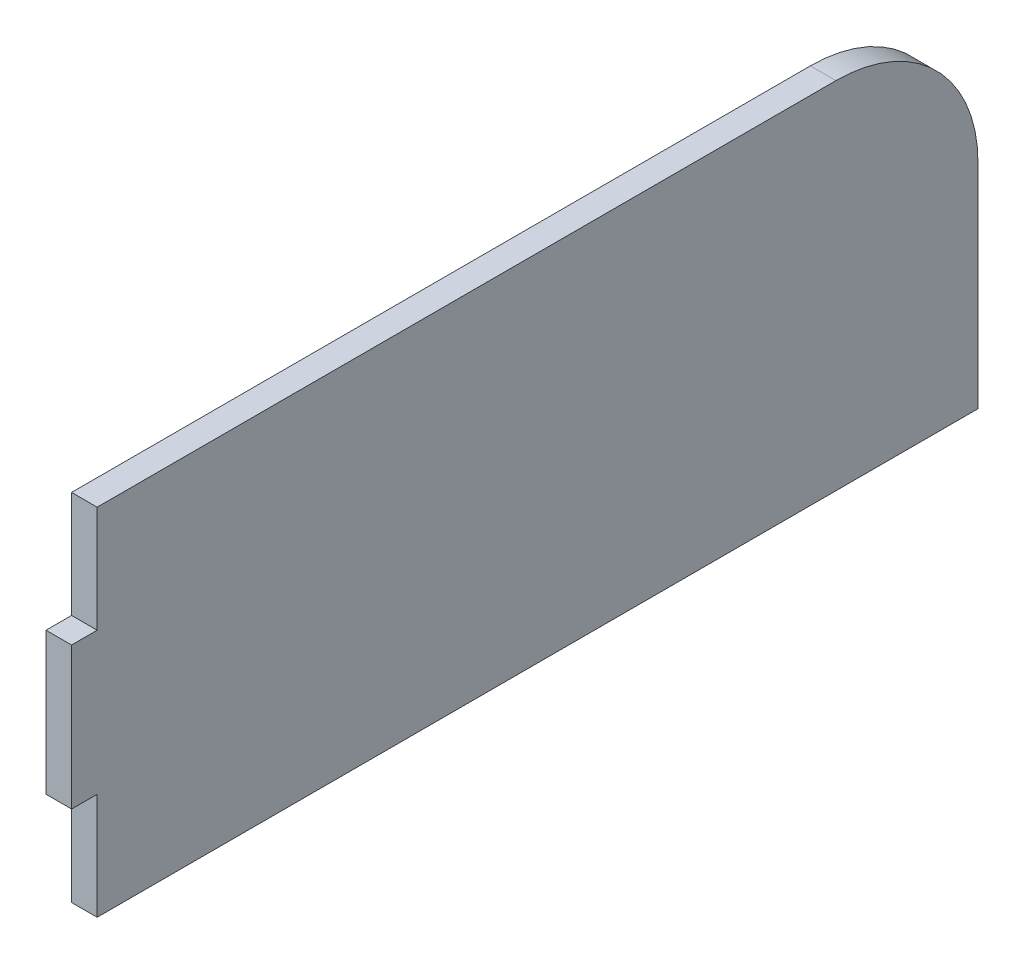
ISO-10303-21;
HEADER;
FILE_DESCRIPTION(('STEP AP214'),'2;1');
FILE_NAME('part.step','',(''),(''),'','','');
FILE_SCHEMA(('AUTOMOTIVE_DESIGN { 1 0 10303 214 1 1 1 1 }'));
ENDSEC;
DATA;
#1=APPLICATION_CONTEXT('core data for automotive mechanical design processes');
#2=APPLICATION_PROTOCOL_DEFINITION('international standard','automotive_design',2000,#1);
#3=PRODUCT_CONTEXT('',#1,'mechanical');
#4=PRODUCT('Part','Part','',(#3));
#5=PRODUCT_RELATED_PRODUCT_CATEGORY('part','',(#4));
#6=PRODUCT_DEFINITION_FORMATION('','',#4);
#7=PRODUCT_DEFINITION_CONTEXT('part definition',#1,'design');
#8=PRODUCT_DEFINITION('design','',#6,#7);
#9=PRODUCT_DEFINITION_SHAPE('','',#8);
#10=(LENGTH_UNIT() NAMED_UNIT(*) SI_UNIT(.MILLI.,.METRE.));
#11=(NAMED_UNIT(*) PLANE_ANGLE_UNIT() SI_UNIT($,.RADIAN.));
#12=(NAMED_UNIT(*) SI_UNIT($,.STERADIAN.) SOLID_ANGLE_UNIT());
#13=UNCERTAINTY_MEASURE_WITH_UNIT(LENGTH_MEASURE(1.E-05),#10,'distance_accuracy_value','');
#14=(GEOMETRIC_REPRESENTATION_CONTEXT(3) GLOBAL_UNCERTAINTY_ASSIGNED_CONTEXT((#13)) GLOBAL_UNIT_ASSIGNED_CONTEXT((#10,
#11,#12)) REPRESENTATION_CONTEXT('',''));
#15=CARTESIAN_POINT('',(0.,0.,0.));
#16=DIRECTION('',(0.,0.,1.));
#17=DIRECTION('',(1.,0.,0.));
#18=AXIS2_PLACEMENT_3D('',#15,#16,#17);
#19=CARTESIAN_POINT('',(18.,0.,0.));
#20=DIRECTION('',(0.,0.,-1.));
#21=DIRECTION('',(-1.,0.,0.));
#22=AXIS2_PLACEMENT_3D('',#19,#20,#21);
#23=PLANE('',#22);
#24=DIRECTION('',(0.,-1.,0.));
#25=VECTOR('',#24,1.);
#26=CARTESIAN_POINT('',(0.,0.,0.));
#27=LINE('',#26,#25);
#28=CARTESIAN_POINT('',(0.,0.,0.));
#29=VERTEX_POINT('',#28);
#30=CARTESIAN_POINT('',(0.,-75.0000000000002,0.));
#31=VERTEX_POINT('',#30);
#32=EDGE_CURVE('E135',#29,#31,#27,.T.);
#33=ORIENTED_EDGE('',*,*,#32,.T.);
#34=DIRECTION('',(-1.,0.,0.));
#35=VECTOR('',#34,1.);
#36=CARTESIAN_POINT('',(18.,-75.0000000000002,0.));
#37=LINE('',#36,#35);
#38=CARTESIAN_POINT('',(18.,-75.0000000000002,0.));
#39=VERTEX_POINT('',#38);
#40=EDGE_CURVE('E11',#39,#31,#37,.T.);
#41=ORIENTED_EDGE('',*,*,#40,.F.);
#42=DIRECTION('',(0.,-1.,0.));
#43=VECTOR('',#42,1.);
#44=CARTESIAN_POINT('',(18.,0.,0.));
#45=LINE('',#44,#43);
#46=CARTESIAN_POINT('',(18.,0.,0.));
#47=VERTEX_POINT('',#46);
#48=EDGE_CURVE('E151',#47,#39,#45,.T.);
#49=ORIENTED_EDGE('',*,*,#48,.F.);
#50=DIRECTION('',(-1.,0.,0.));
#51=VECTOR('',#50,1.);
#52=CARTESIAN_POINT('',(18.,0.,0.));
#53=LINE('',#52,#51);
#54=EDGE_CURVE('E131',#47,#29,#53,.T.);
#55=ORIENTED_EDGE('',*,*,#54,.T.);
#56=EDGE_LOOP('',(#33,#41,#49,#55));
#57=FACE_BOUND('',#56,.T.);
#58=ADVANCED_FACE('F33',(#57),#23,.F.);
#59=CARTESIAN_POINT('',(18.,-75.0000000000002,0.));
#60=DIRECTION('',(0.,-1.,0.));
#61=DIRECTION('',(0.,0.,-1.));
#62=AXIS2_PLACEMENT_3D('',#59,#60,#61);
#63=PLANE('',#62);
#64=DIRECTION('',(0.,0.,1.));
#65=VECTOR('',#64,1.);
#66=CARTESIAN_POINT('',(0.,-75.0000000000002,0.));
#67=LINE('',#66,#65);
#68=CARTESIAN_POINT('',(0.,-75.0000000000002,18.));
#69=VERTEX_POINT('',#68);
#70=EDGE_CURVE('E138',#31,#69,#67,.T.);
#71=ORIENTED_EDGE('',*,*,#70,.T.);
#72=DIRECTION('',(-1.,0.,0.));
#73=VECTOR('',#72,1.);
#74=CARTESIAN_POINT('',(18.,-75.0000000000002,18.));
#75=LINE('',#74,#73);
#76=CARTESIAN_POINT('',(18.,-75.0000000000002,18.));
#77=VERTEX_POINT('',#76);
#78=EDGE_CURVE('E41',#77,#69,#75,.T.);
#79=ORIENTED_EDGE('',*,*,#78,.F.);
#80=DIRECTION('',(0.,0.,1.));
#81=VECTOR('',#80,1.);
#82=CARTESIAN_POINT('',(18.,-75.0000000000002,0.));
#83=LINE('',#82,#81);
#84=EDGE_CURVE('E95',#39,#77,#83,.T.);
#85=ORIENTED_EDGE('',*,*,#84,.F.);
#86=ORIENTED_EDGE('',*,*,#40,.T.);
#87=EDGE_LOOP('',(#71,#79,#85,#86));
#88=FACE_BOUND('',#87,.T.);
#89=ADVANCED_FACE('F194',(#88),#63,.F.);
#90=CARTESIAN_POINT('',(18.,-75.0000000000002,18.));
#91=DIRECTION('',(0.,0.,-1.));
#92=DIRECTION('',(0.,1.,0.));
#93=AXIS2_PLACEMENT_3D('',#90,#91,#92);
#94=PLANE('',#93);
#95=DIRECTION('',(0.,-1.,0.));
#96=VECTOR('',#95,1.);
#97=CARTESIAN_POINT('',(0.,-75.0000000000002,18.));
#98=LINE('',#97,#96);
#99=CARTESIAN_POINT('',(0.,-175.,18.));
#100=VERTEX_POINT('',#99);
#101=EDGE_CURVE('E140',#69,#100,#98,.T.);
#102=ORIENTED_EDGE('',*,*,#101,.T.);
#103=DIRECTION('',(-1.,0.,0.));
#104=VECTOR('',#103,1.);
#105=CARTESIAN_POINT('',(18.,-175.,18.));
#106=LINE('',#105,#104);
#107=CARTESIAN_POINT('',(18.,-175.,18.));
#108=VERTEX_POINT('',#107);
#109=EDGE_CURVE('E161',#108,#100,#106,.T.);
#110=ORIENTED_EDGE('',*,*,#109,.F.);
#111=DIRECTION('',(0.,-1.,0.));
#112=VECTOR('',#111,1.);
#113=CARTESIAN_POINT('',(18.,-75.0000000000002,18.));
#114=LINE('',#113,#112);
#115=EDGE_CURVE('E169',#77,#108,#114,.T.);
#116=ORIENTED_EDGE('',*,*,#115,.F.);
#117=ORIENTED_EDGE('',*,*,#78,.T.);
#118=EDGE_LOOP('',(#102,#110,#116,#117));
#119=FACE_BOUND('',#118,.T.);
#120=ADVANCED_FACE('F167',(#119),#94,.F.);
#121=CARTESIAN_POINT('',(18.,-175.,0.));
#122=DIRECTION('',(0.,1.,0.));
#123=DIRECTION('',(0.,0.,1.));
#124=AXIS2_PLACEMENT_3D('',#121,#122,#123);
#125=PLANE('',#124);
#126=DIRECTION('',(0.,0.,-1.));
#127=VECTOR('',#126,1.);
#128=CARTESIAN_POINT('',(0.,-175.,0.));
#129=LINE('',#128,#127);
#130=CARTESIAN_POINT('',(0.,-175.,0.));
#131=VERTEX_POINT('',#130);
#132=EDGE_CURVE('E142',#100,#131,#129,.T.);
#133=ORIENTED_EDGE('',*,*,#132,.T.);
#134=DIRECTION('',(-1.,0.,0.));
#135=VECTOR('',#134,1.);
#136=CARTESIAN_POINT('',(18.,-175.,0.));
#137=LINE('',#136,#135);
#138=CARTESIAN_POINT('',(18.,-175.,0.));
#139=VERTEX_POINT('',#138);
#140=EDGE_CURVE('E158',#139,#131,#137,.T.);
#141=ORIENTED_EDGE('',*,*,#140,.F.);
#142=DIRECTION('',(0.,0.,-1.));
#143=VECTOR('',#142,1.);
#144=CARTESIAN_POINT('',(18.,-175.,0.));
#145=LINE('',#144,#143);
#146=EDGE_CURVE('E185',#108,#139,#145,.T.);
#147=ORIENTED_EDGE('',*,*,#146,.F.);
#148=ORIENTED_EDGE('',*,*,#109,.T.);
#149=EDGE_LOOP('',(#133,#141,#147,#148));
#150=FACE_BOUND('',#149,.T.);
#151=ADVANCED_FACE('F178',(#150),#125,.F.);
#152=CARTESIAN_POINT('',(18.,-175.,0.));
#153=DIRECTION('',(0.,0.,-1.));
#154=DIRECTION('',(-1.,0.,0.));
#155=AXIS2_PLACEMENT_3D('',#152,#153,#154);
#156=PLANE('',#155);
#157=DIRECTION('',(0.,-1.,0.));
#158=VECTOR('',#157,1.);
#159=CARTESIAN_POINT('',(0.,-175.,0.));
#160=LINE('',#159,#158);
#161=CARTESIAN_POINT('',(0.,-250.,0.));
#162=VERTEX_POINT('',#161);
#163=EDGE_CURVE('E144',#131,#162,#160,.T.);
#164=ORIENTED_EDGE('',*,*,#163,.T.);
#165=DIRECTION('',(-1.,0.,0.));
#166=VECTOR('',#165,1.);
#167=CARTESIAN_POINT('',(18.,-250.,0.));
#168=LINE('',#167,#166);
#169=CARTESIAN_POINT('',(18.,-250.,0.));
#170=VERTEX_POINT('',#169);
#171=EDGE_CURVE('E155',#170,#162,#168,.T.);
#172=ORIENTED_EDGE('',*,*,#171,.F.);
#173=DIRECTION('',(0.,-1.,0.));
#174=VECTOR('',#173,1.);
#175=CARTESIAN_POINT('',(18.,-175.,0.));
#176=LINE('',#175,#174);
#177=EDGE_CURVE('E184',#139,#170,#176,.T.);
#178=ORIENTED_EDGE('',*,*,#177,.F.);
#179=ORIENTED_EDGE('',*,*,#140,.T.);
#180=EDGE_LOOP('',(#164,#172,#178,#179));
#181=FACE_BOUND('',#180,.T.);
#182=ADVANCED_FACE('F182',(#181),#156,.F.);
#183=CARTESIAN_POINT('',(18.,-250.,0.));
#184=DIRECTION('',(0.,1.,0.));
#185=DIRECTION('',(0.,0.,1.));
#186=AXIS2_PLACEMENT_3D('',#183,#184,#185);
#187=PLANE('',#186);
#188=DIRECTION('',(0.,0.,-1.));
#189=VECTOR('',#188,1.);
#190=CARTESIAN_POINT('',(0.,-250.,0.));
#191=LINE('',#190,#189);
#192=CARTESIAN_POINT('',(0.,-250.,-620.));
#193=VERTEX_POINT('',#192);
#194=EDGE_CURVE('E146',#162,#193,#191,.T.);
#195=ORIENTED_EDGE('',*,*,#194,.T.);
#196=DIRECTION('',(-1.,0.,0.));
#197=VECTOR('',#196,1.);
#198=CARTESIAN_POINT('',(18.,-250.,-620.));
#199=LINE('',#198,#197);
#200=CARTESIAN_POINT('',(18.,-250.,-620.));
#201=VERTEX_POINT('',#200);
#202=EDGE_CURVE('E126',#201,#193,#199,.T.);
#203=ORIENTED_EDGE('',*,*,#202,.F.);
#204=DIRECTION('',(0.,0.,-1.));
#205=VECTOR('',#204,1.);
#206=CARTESIAN_POINT('',(18.,-250.,0.));
#207=LINE('',#206,#205);
#208=EDGE_CURVE('E117',#170,#201,#207,.T.);
#209=ORIENTED_EDGE('',*,*,#208,.F.);
#210=ORIENTED_EDGE('',*,*,#171,.T.);
#211=EDGE_LOOP('',(#195,#203,#209,#210));
#212=FACE_BOUND('',#211,.T.);
#213=ADVANCED_FACE('F206',(#212),#187,.F.);
#214=CARTESIAN_POINT('',(18.,-100.,-620.));
#215=DIRECTION('',(0.,0.,1.));
#216=DIRECTION('',(0.,-1.,0.));
#217=AXIS2_PLACEMENT_3D('',#214,#215,#216);
#218=PLANE('',#217);
#219=DIRECTION('',(0.,1.,0.));
#220=VECTOR('',#219,1.);
#221=CARTESIAN_POINT('',(0.,-100.,-620.));
#222=LINE('',#221,#220);
#223=CARTESIAN_POINT('',(0.,-100.,-620.));
#224=VERTEX_POINT('',#223);
#225=EDGE_CURVE('E125',#193,#224,#222,.T.);
#226=ORIENTED_EDGE('',*,*,#225,.T.);
#227=DIRECTION('',(-1.,0.,0.));
#228=VECTOR('',#227,1.);
#229=CARTESIAN_POINT('',(18.,-100.,-620.));
#230=LINE('',#229,#228);
#231=CARTESIAN_POINT('',(18.,-100.,-620.));
#232=VERTEX_POINT('',#231);
#233=EDGE_CURVE('E122',#232,#224,#230,.T.);
#234=ORIENTED_EDGE('',*,*,#233,.F.);
#235=DIRECTION('',(0.,1.,0.));
#236=VECTOR('',#235,1.);
#237=CARTESIAN_POINT('',(18.,-100.,-620.));
#238=LINE('',#237,#236);
#239=EDGE_CURVE('E111',#201,#232,#238,.T.);
#240=ORIENTED_EDGE('',*,*,#239,.F.);
#241=ORIENTED_EDGE('',*,*,#202,.T.);
#242=EDGE_LOOP('',(#226,#234,#240,#241));
#243=FACE_BOUND('',#242,.T.);
#244=ADVANCED_FACE('F123',(#243),#218,.F.);
#245=CARTESIAN_POINT('',(18.,-100.,-520.));
#246=DIRECTION('',(-1.,0.,0.));
#247=DIRECTION('',(0.,0.,1.));
#248=AXIS2_PLACEMENT_3D('',#245,#246,#247);
#249=CYLINDRICAL_SURFACE('',#248,99.9999999999999);
#250=CARTESIAN_POINT('',(0.,-100.,-520.));
#251=DIRECTION('',(1.,0.,0.));
#252=DIRECTION('',(0.,0.,-1.));
#253=AXIS2_PLACEMENT_3D('',#250,#251,#252);
#254=CIRCLE('',#253,99.9999999999999);
#255=CARTESIAN_POINT('',(0.,0.,-520.));
#256=VERTEX_POINT('',#255);
#257=EDGE_CURVE('E81',#224,#256,#254,.T.);
#258=ORIENTED_EDGE('',*,*,#257,.T.);
#259=DIRECTION('',(-1.,0.,0.));
#260=VECTOR('',#259,1.);
#261=CARTESIAN_POINT('',(18.,0.,-520.));
#262=LINE('',#261,#260);
#263=CARTESIAN_POINT('',(18.,0.,-520.));
#264=VERTEX_POINT('',#263);
#265=EDGE_CURVE('E127',#264,#256,#262,.T.);
#266=ORIENTED_EDGE('',*,*,#265,.F.);
#267=CARTESIAN_POINT('',(18.,-100.,-520.));
#268=DIRECTION('',(1.,0.,0.));
#269=DIRECTION('',(0.,0.,-1.));
#270=AXIS2_PLACEMENT_3D('',#267,#268,#269);
#271=CIRCLE('',#270,99.9999999999999);
#272=EDGE_CURVE('E115',#232,#264,#271,.T.);
#273=ORIENTED_EDGE('',*,*,#272,.F.);
#274=ORIENTED_EDGE('',*,*,#233,.T.);
#275=EDGE_LOOP('',(#258,#266,#273,#274));
#276=FACE_BOUND('',#275,.T.);
#277=ADVANCED_FACE('F129',(#276),#249,.T.);
#278=CARTESIAN_POINT('',(18.,0.,0.));
#279=DIRECTION('',(0.,-1.,0.));
#280=DIRECTION('',(0.,0.,-1.));
#281=AXIS2_PLACEMENT_3D('',#278,#279,#280);
#282=PLANE('',#281);
#283=DIRECTION('',(0.,0.,1.));
#284=VECTOR('',#283,1.);
#285=CARTESIAN_POINT('',(0.,0.,0.));
#286=LINE('',#285,#284);
#287=EDGE_CURVE('E87',#256,#29,#286,.T.);
#288=ORIENTED_EDGE('',*,*,#287,.T.);
#289=ORIENTED_EDGE('',*,*,#54,.F.);
#290=DIRECTION('',(0.,0.,1.));
#291=VECTOR('',#290,1.);
#292=CARTESIAN_POINT('',(18.,0.,0.));
#293=LINE('',#292,#291);
#294=EDGE_CURVE('E49',#264,#47,#293,.T.);
#295=ORIENTED_EDGE('',*,*,#294,.F.);
#296=ORIENTED_EDGE('',*,*,#265,.T.);
#297=EDGE_LOOP('',(#288,#289,#295,#296));
#298=FACE_BOUND('',#297,.T.);
#299=ADVANCED_FACE('F214',(#298),#282,.F.);
#300=CARTESIAN_POINT('',(18.,-100.,-520.));
#301=DIRECTION('',(1.,0.,0.));
#302=DIRECTION('',(0.,0.,-1.));
#303=AXIS2_PLACEMENT_3D('',#300,#301,#302);
#304=PLANE('',#303);
#305=ORIENTED_EDGE('',*,*,#48,.T.);
#306=ORIENTED_EDGE('',*,*,#84,.T.);
#307=ORIENTED_EDGE('',*,*,#115,.T.);
#308=ORIENTED_EDGE('',*,*,#146,.T.);
#309=ORIENTED_EDGE('',*,*,#177,.T.);
#310=ORIENTED_EDGE('',*,*,#208,.T.);
#311=ORIENTED_EDGE('',*,*,#239,.T.);
#312=ORIENTED_EDGE('',*,*,#272,.T.);
#313=ORIENTED_EDGE('',*,*,#294,.T.);
#314=EDGE_LOOP('',(#305,#306,#307,#308,#309,#310,#311,#312,#313));
#315=FACE_BOUND('',#314,.T.);
#316=ADVANCED_FACE('F113',(#315),#304,.T.);
#317=CARTESIAN_POINT('',(0.,-100.,-520.));
#318=DIRECTION('',(1.,0.,0.));
#319=DIRECTION('',(0.,0.,-1.));
#320=AXIS2_PLACEMENT_3D('',#317,#318,#319);
#321=PLANE('',#320);
#322=ORIENTED_EDGE('',*,*,#32,.F.);
#323=ORIENTED_EDGE('',*,*,#287,.F.);
#324=ORIENTED_EDGE('',*,*,#257,.F.);
#325=ORIENTED_EDGE('',*,*,#225,.F.);
#326=ORIENTED_EDGE('',*,*,#194,.F.);
#327=ORIENTED_EDGE('',*,*,#163,.F.);
#328=ORIENTED_EDGE('',*,*,#132,.F.);
#329=ORIENTED_EDGE('',*,*,#101,.F.);
#330=ORIENTED_EDGE('',*,*,#70,.F.);
#331=EDGE_LOOP('',(#322,#323,#324,#325,#326,#327,#328,#329,#330));
#332=FACE_BOUND('',#331,.T.);
#333=ADVANCED_FACE('F173',(#332),#321,.F.);
#334=CLOSED_SHELL('',(#58,#89,#120,#151,#182,#213,#244,#277,#299,#316,#333));
#335=MANIFOLD_SOLID_BREP('B2',#334);
#336=ADVANCED_BREP_SHAPE_REPRESENTATION('',(#18,#335),#14);
#337=SHAPE_DEFINITION_REPRESENTATION(#9,#336);
ENDSEC;
END-ISO-10303-21;
